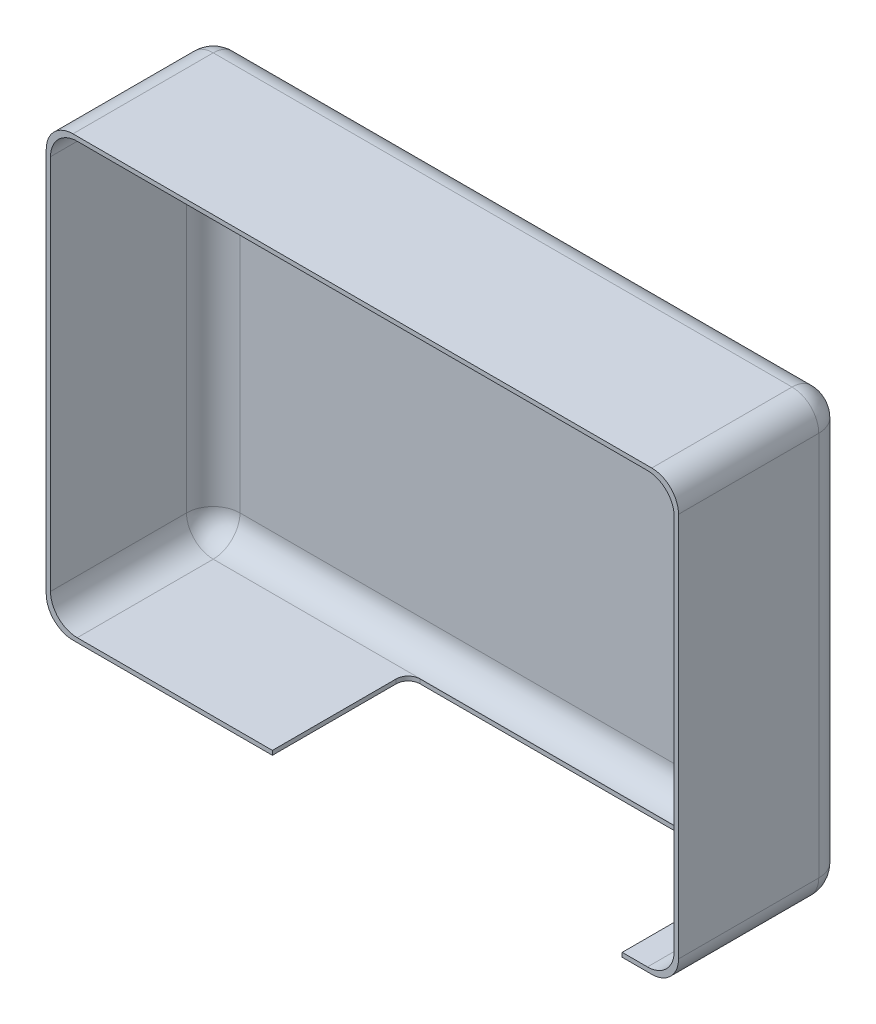
ISO-10303-21;
HEADER;
FILE_DESCRIPTION(('STEP AP214'),'2;1');
FILE_NAME('part.step','',(''),(''),'','','');
FILE_SCHEMA(('AUTOMOTIVE_DESIGN { 1 0 10303 214 1 1 1 1 }'));
ENDSEC;
DATA;
#1=APPLICATION_CONTEXT('core data for automotive mechanical design processes');
#2=APPLICATION_PROTOCOL_DEFINITION('international standard','automotive_design',2000,#1);
#3=PRODUCT_CONTEXT('',#1,'mechanical');
#4=PRODUCT('Part','Part','',(#3));
#5=PRODUCT_RELATED_PRODUCT_CATEGORY('part','',(#4));
#6=PRODUCT_DEFINITION_FORMATION('','',#4);
#7=PRODUCT_DEFINITION_CONTEXT('part definition',#1,'design');
#8=PRODUCT_DEFINITION('design','',#6,#7);
#9=PRODUCT_DEFINITION_SHAPE('','',#8);
#10=(LENGTH_UNIT() NAMED_UNIT(*) SI_UNIT(.MILLI.,.METRE.));
#11=(NAMED_UNIT(*) PLANE_ANGLE_UNIT() SI_UNIT($,.RADIAN.));
#12=(NAMED_UNIT(*) SI_UNIT($,.STERADIAN.) SOLID_ANGLE_UNIT());
#13=UNCERTAINTY_MEASURE_WITH_UNIT(LENGTH_MEASURE(1.E-05),#10,'distance_accuracy_value','');
#14=(GEOMETRIC_REPRESENTATION_CONTEXT(3) GLOBAL_UNCERTAINTY_ASSIGNED_CONTEXT((#13)) GLOBAL_UNIT_ASSIGNED_CONTEXT((#10,
#11,#12)) REPRESENTATION_CONTEXT('',''));
#15=CARTESIAN_POINT('',(0.,0.,0.));
#16=DIRECTION('',(0.,0.,1.));
#17=DIRECTION('',(1.,0.,0.));
#18=AXIS2_PLACEMENT_3D('',#15,#16,#17);
#19=CARTESIAN_POINT('',(-41.4059441680608,-197.145783761646,14.224));
#20=DIRECTION('',(-1.,0.,0.));
#21=DIRECTION('',(0.,0.,1.));
#22=AXIS2_PLACEMENT_3D('',#19,#20,#21);
#23=CYLINDRICAL_SURFACE('',#22,14.224);
#24=CARTESIAN_POINT('',(-41.4059441680606,-197.145783761646,14.224));
#25=DIRECTION('',(-1.,0.,0.));
#26=DIRECTION('',(0.,0.,1.));
#27=AXIS2_PLACEMENT_3D('',#24,#25,#26);
#28=CIRCLE('',#27,14.224);
#29=CARTESIAN_POINT('',(-41.4059441680606,-197.145783761646,0.));
#30=VERTEX_POINT('',#29);
#31=CARTESIAN_POINT('',(-41.4059441680606,-211.369783761646,14.224));
#32=VERTEX_POINT('',#31);
#33=EDGE_CURVE('E11',#30,#32,#28,.T.);
#34=ORIENTED_EDGE('',*,*,#33,.F.);
#35=DIRECTION('',(-1.,0.,0.));
#36=VECTOR('',#35,1.);
#37=CARTESIAN_POINT('',(-41.4059441680608,-197.145783761646,0.));
#38=LINE('',#37,#36);
#39=CARTESIAN_POINT('',(266.696055831939,-197.145783761646,0.));
#40=VERTEX_POINT('',#39);
#41=EDGE_CURVE('E392',#40,#30,#38,.T.);
#42=ORIENTED_EDGE('',*,*,#41,.F.);
#43=CARTESIAN_POINT('',(266.696055831939,-197.145783761646,14.224));
#44=DIRECTION('',(-1.,0.,0.));
#45=DIRECTION('',(0.,-1.,0.));
#46=AXIS2_PLACEMENT_3D('',#43,#44,#45);
#47=CIRCLE('',#46,14.224);
#48=CARTESIAN_POINT('',(266.696055831939,-211.369783761646,14.224));
#49=VERTEX_POINT('',#48);
#50=EDGE_CURVE('E40',#40,#49,#47,.T.);
#51=ORIENTED_EDGE('',*,*,#50,.T.);
#52=DIRECTION('',(-1.,0.,0.));
#53=VECTOR('',#52,1.);
#54=CARTESIAN_POINT('',(-41.4059441680606,-211.369783761646,14.224));
#55=LINE('',#54,#53);
#56=EDGE_CURVE('E422',#32,#49,#55,.F.);
#57=ORIENTED_EDGE('',*,*,#56,.F.);
#58=EDGE_LOOP('',(#34,#42,#51,#57));
#59=FACE_BOUND('',#58,.T.);
#60=ADVANCED_FACE('F33',(#59),#23,.T.);
#61=CARTESIAN_POINT('',(266.696055831939,-197.145783761646,14.224));
#62=DIRECTION('',(0.,0.,1.));
#63=DIRECTION('',(1.,0.,0.));
#64=AXIS2_PLACEMENT_3D('',#61,#62,#63);
#65=SPHERICAL_SURFACE('',#64,14.224);
#66=ORIENTED_EDGE('',*,*,#50,.F.);
#67=CARTESIAN_POINT('',(266.696055831939,-197.145783761645,14.224));
#68=DIRECTION('',(0.,-1.,0.));
#69=DIRECTION('',(0.,0.,-1.));
#70=AXIS2_PLACEMENT_3D('',#67,#68,#69);
#71=CIRCLE('',#70,14.224);
#72=CARTESIAN_POINT('',(280.920055831939,-197.145783761645,14.224));
#73=VERTEX_POINT('',#72);
#74=EDGE_CURVE('E434',#40,#73,#71,.T.);
#75=ORIENTED_EDGE('',*,*,#74,.T.);
#76=CARTESIAN_POINT('',(266.696055831939,-197.145783761646,14.224));
#77=DIRECTION('',(0.,0.,-1.));
#78=DIRECTION('',(-1.,0.,0.));
#79=AXIS2_PLACEMENT_3D('',#76,#77,#78);
#80=CIRCLE('',#79,14.224);
#81=EDGE_CURVE('E419',#49,#73,#80,.F.);
#82=ORIENTED_EDGE('',*,*,#81,.F.);
#83=EDGE_LOOP('',(#66,#75,#82));
#84=FACE_BOUND('',#83,.T.);
#85=ADVANCED_FACE('F438',(#84),#65,.T.);
#86=CARTESIAN_POINT('',(266.696055831939,7.83221623835449,14.224));
#87=DIRECTION('',(0.,-1.,0.));
#88=DIRECTION('',(1.,0.,0.));
#89=AXIS2_PLACEMENT_3D('',#86,#87,#88);
#90=CYLINDRICAL_SURFACE('',#89,14.224);
#91=ORIENTED_EDGE('',*,*,#74,.F.);
#92=DIRECTION('',(0.,-1.,0.));
#93=VECTOR('',#92,1.);
#94=CARTESIAN_POINT('',(266.696055831939,7.83221623835449,0.));
#95=LINE('',#94,#93);
#96=CARTESIAN_POINT('',(266.696055831939,7.83221623835431,0.));
#97=VERTEX_POINT('',#96);
#98=EDGE_CURVE('E395',#97,#40,#95,.T.);
#99=ORIENTED_EDGE('',*,*,#98,.F.);
#100=CARTESIAN_POINT('',(266.696055831939,7.83221623835441,14.224));
#101=DIRECTION('',(0.,-1.,0.));
#102=DIRECTION('',(1.,0.,0.));
#103=AXIS2_PLACEMENT_3D('',#100,#101,#102);
#104=CIRCLE('',#103,14.224);
#105=CARTESIAN_POINT('',(280.920055831939,7.83221623835431,14.224));
#106=VERTEX_POINT('',#105);
#107=EDGE_CURVE('E432',#97,#106,#104,.T.);
#108=ORIENTED_EDGE('',*,*,#107,.T.);
#109=DIRECTION('',(0.,-1.,0.));
#110=VECTOR('',#109,1.);
#111=CARTESIAN_POINT('',(280.920055831939,7.83221623835431,14.224));
#112=LINE('',#111,#110);
#113=EDGE_CURVE('E416',#73,#106,#112,.F.);
#114=ORIENTED_EDGE('',*,*,#113,.F.);
#115=EDGE_LOOP('',(#91,#99,#108,#114));
#116=FACE_BOUND('',#115,.T.);
#117=ADVANCED_FACE('F448',(#116),#90,.T.);
#118=CARTESIAN_POINT('',(266.696055831939,7.83221623835441,14.224));
#119=DIRECTION('',(0.,0.,1.));
#120=DIRECTION('',(1.,0.,0.));
#121=AXIS2_PLACEMENT_3D('',#118,#119,#120);
#122=SPHERICAL_SURFACE('',#121,14.224);
#123=ORIENTED_EDGE('',*,*,#107,.F.);
#124=CARTESIAN_POINT('',(266.696055831939,7.83221623835441,14.224));
#125=DIRECTION('',(1.,0.,0.));
#126=DIRECTION('',(0.,0.,-1.));
#127=AXIS2_PLACEMENT_3D('',#124,#125,#126);
#128=CIRCLE('',#127,14.224);
#129=CARTESIAN_POINT('',(266.696055831939,22.0562162383544,14.224));
#130=VERTEX_POINT('',#129);
#131=EDGE_CURVE('E430',#97,#130,#128,.T.);
#132=ORIENTED_EDGE('',*,*,#131,.T.);
#133=CARTESIAN_POINT('',(266.696055831939,7.83221623835441,14.224));
#134=DIRECTION('',(0.,0.,-1.));
#135=DIRECTION('',(-1.,0.,0.));
#136=AXIS2_PLACEMENT_3D('',#133,#134,#135);
#137=CIRCLE('',#136,14.224);
#138=EDGE_CURVE('E413',#106,#130,#137,.F.);
#139=ORIENTED_EDGE('',*,*,#138,.F.);
#140=EDGE_LOOP('',(#123,#132,#139));
#141=FACE_BOUND('',#140,.T.);
#142=ADVANCED_FACE('F485',(#141),#122,.T.);
#143=CARTESIAN_POINT('',(-41.4059441680608,7.83221623835441,14.224));
#144=DIRECTION('',(1.,0.,0.));
#145=DIRECTION('',(0.,0.,-1.));
#146=AXIS2_PLACEMENT_3D('',#143,#144,#145);
#147=CYLINDRICAL_SURFACE('',#146,14.224);
#148=ORIENTED_EDGE('',*,*,#131,.F.);
#149=DIRECTION('',(1.,0.,0.));
#150=VECTOR('',#149,1.);
#151=CARTESIAN_POINT('',(-41.4059441680608,7.83221623835441,0.));
#152=LINE('',#151,#150);
#153=CARTESIAN_POINT('',(-41.4059441680607,7.83221623835441,0.));
#154=VERTEX_POINT('',#153);
#155=EDGE_CURVE('E398',#154,#97,#152,.T.);
#156=ORIENTED_EDGE('',*,*,#155,.F.);
#157=CARTESIAN_POINT('',(-41.4059441680608,7.83221623835441,14.224));
#158=DIRECTION('',(1.,0.,0.));
#159=DIRECTION('',(0.,1.,0.));
#160=AXIS2_PLACEMENT_3D('',#157,#158,#159);
#161=CIRCLE('',#160,14.224);
#162=CARTESIAN_POINT('',(-41.4059441680607,22.0562162383544,14.224));
#163=VERTEX_POINT('',#162);
#164=EDGE_CURVE('E428',#154,#163,#161,.T.);
#165=ORIENTED_EDGE('',*,*,#164,.T.);
#166=DIRECTION('',(1.,0.,0.));
#167=VECTOR('',#166,1.);
#168=CARTESIAN_POINT('',(-41.4059441680607,22.0562162383544,14.224));
#169=LINE('',#168,#167);
#170=EDGE_CURVE('E410',#130,#163,#169,.F.);
#171=ORIENTED_EDGE('',*,*,#170,.F.);
#172=EDGE_LOOP('',(#148,#156,#165,#171));
#173=FACE_BOUND('',#172,.T.);
#174=ADVANCED_FACE('F482',(#173),#147,.T.);
#175=CARTESIAN_POINT('',(-41.4059441680608,7.83221623835441,14.224));
#176=DIRECTION('',(0.,0.,1.));
#177=DIRECTION('',(1.,0.,0.));
#178=AXIS2_PLACEMENT_3D('',#175,#176,#177);
#179=SPHERICAL_SURFACE('',#178,14.224);
#180=ORIENTED_EDGE('',*,*,#164,.F.);
#181=CARTESIAN_POINT('',(-41.4059441680608,7.83221623835431,14.224));
#182=DIRECTION('',(0.,1.,0.));
#183=DIRECTION('',(-1.,0.,0.));
#184=AXIS2_PLACEMENT_3D('',#181,#182,#183);
#185=CIRCLE('',#184,14.224);
#186=CARTESIAN_POINT('',(-55.6299441680608,7.83221623835431,14.224));
#187=VERTEX_POINT('',#186);
#188=EDGE_CURVE('E426',#154,#187,#185,.T.);
#189=ORIENTED_EDGE('',*,*,#188,.T.);
#190=CARTESIAN_POINT('',(-41.4059441680608,7.83221623835441,14.224));
#191=DIRECTION('',(0.,0.,-1.));
#192=DIRECTION('',(-1.,0.,0.));
#193=AXIS2_PLACEMENT_3D('',#190,#191,#192);
#194=CIRCLE('',#193,14.224);
#195=EDGE_CURVE('E407',#163,#187,#194,.F.);
#196=ORIENTED_EDGE('',*,*,#195,.F.);
#197=EDGE_LOOP('',(#180,#189,#196));
#198=FACE_BOUND('',#197,.T.);
#199=ADVANCED_FACE('F587',(#198),#179,.T.);
#200=CARTESIAN_POINT('',(-41.4059441680608,7.83221623835441,14.224));
#201=DIRECTION('',(0.,1.,0.));
#202=DIRECTION('',(-1.,0.,0.));
#203=AXIS2_PLACEMENT_3D('',#200,#201,#202);
#204=CYLINDRICAL_SURFACE('',#203,14.224);
#205=ORIENTED_EDGE('',*,*,#188,.F.);
#206=DIRECTION('',(0.,1.,0.));
#207=VECTOR('',#206,1.);
#208=CARTESIAN_POINT('',(-41.4059441680608,7.83221623835441,0.));
#209=LINE('',#208,#207);
#210=EDGE_CURVE('E401',#30,#154,#209,.T.);
#211=ORIENTED_EDGE('',*,*,#210,.F.);
#212=CARTESIAN_POINT('',(-41.4059441680607,-197.145783761646,14.224));
#213=DIRECTION('',(0.,1.,0.));
#214=DIRECTION('',(-1.,0.,0.));
#215=AXIS2_PLACEMENT_3D('',#212,#213,#214);
#216=CIRCLE('',#215,14.224);
#217=CARTESIAN_POINT('',(-55.6299441680607,-197.145783761645,14.224));
#218=VERTEX_POINT('',#217);
#219=EDGE_CURVE('E424',#30,#218,#216,.T.);
#220=ORIENTED_EDGE('',*,*,#219,.T.);
#221=DIRECTION('',(0.,1.,0.));
#222=VECTOR('',#221,1.);
#223=CARTESIAN_POINT('',(-55.6299441680608,7.83221623835431,14.224));
#224=LINE('',#223,#222);
#225=EDGE_CURVE('E404',#187,#218,#224,.F.);
#226=ORIENTED_EDGE('',*,*,#225,.F.);
#227=EDGE_LOOP('',(#205,#211,#220,#226));
#228=FACE_BOUND('',#227,.T.);
#229=ADVANCED_FACE('F476',(#228),#204,.T.);
#230=CARTESIAN_POINT('',(-41.4059441680607,-197.145783761646,14.224));
#231=DIRECTION('',(0.,0.,1.));
#232=DIRECTION('',(1.,0.,0.));
#233=AXIS2_PLACEMENT_3D('',#230,#231,#232);
#234=SPHERICAL_SURFACE('',#233,14.224);
#235=ORIENTED_EDGE('',*,*,#219,.F.);
#236=ORIENTED_EDGE('',*,*,#33,.T.);
#237=CARTESIAN_POINT('',(-41.4059441680607,-197.145783761646,14.224));
#238=DIRECTION('',(0.,0.,-1.));
#239=DIRECTION('',(-1.,0.,0.));
#240=AXIS2_PLACEMENT_3D('',#237,#238,#239);
#241=CIRCLE('',#240,14.224);
#242=EDGE_CURVE('E389',#218,#32,#241,.F.);
#243=ORIENTED_EDGE('',*,*,#242,.F.);
#244=EDGE_LOOP('',(#235,#236,#243));
#245=FACE_BOUND('',#244,.T.);
#246=ADVANCED_FACE('F471',(#245),#234,.T.);
#247=CARTESIAN_POINT('',(-39.1199441680606,-194.859783761646,16.51));
#248=DIRECTION('',(0.,-1.,0.));
#249=DIRECTION('',(1.,0.,0.));
#250=AXIS2_PLACEMENT_3D('',#247,#248,#249);
#251=CYLINDRICAL_SURFACE('',#250,14.224);
#252=CARTESIAN_POINT('',(-39.1199441680606,-194.859783761646,16.51));
#253=DIRECTION('',(0.,1.,0.));
#254=DIRECTION('',(0.,0.,1.));
#255=AXIS2_PLACEMENT_3D('',#252,#253,#254);
#256=CIRCLE('',#255,14.224);
#257=CARTESIAN_POINT('',(-39.1199441680606,-194.859783761646,2.286));
#258=VERTEX_POINT('',#257);
#259=CARTESIAN_POINT('',(-53.3439441680606,-194.859783761646,16.51));
#260=VERTEX_POINT('',#259);
#261=EDGE_CURVE('E387',#258,#260,#256,.T.);
#262=ORIENTED_EDGE('',*,*,#261,.F.);
#263=DIRECTION('',(0.,-1.,0.));
#264=VECTOR('',#263,1.);
#265=CARTESIAN_POINT('',(-39.1199441680606,-194.859783761646,2.286));
#266=LINE('',#265,#264);
#267=CARTESIAN_POINT('',(-39.1199441680608,5.54621623835437,2.286));
#268=VERTEX_POINT('',#267);
#269=EDGE_CURVE('E340',#268,#258,#266,.T.);
#270=ORIENTED_EDGE('',*,*,#269,.F.);
#271=CARTESIAN_POINT('',(-39.1199441680608,5.5462162383544,16.51));
#272=DIRECTION('',(0.,1.,0.));
#273=DIRECTION('',(-1.,0.,0.));
#274=AXIS2_PLACEMENT_3D('',#271,#272,#273);
#275=CIRCLE('',#274,14.224);
#276=CARTESIAN_POINT('',(-53.3439441680608,5.54621623835436,16.51));
#277=VERTEX_POINT('',#276);
#278=EDGE_CURVE('E385',#268,#277,#275,.T.);
#279=ORIENTED_EDGE('',*,*,#278,.T.);
#280=DIRECTION('',(0.,-1.,0.));
#281=VECTOR('',#280,1.);
#282=CARTESIAN_POINT('',(-53.3439441680606,-194.859783761646,16.51));
#283=LINE('',#282,#281);
#284=EDGE_CURVE('E370',#260,#277,#283,.F.);
#285=ORIENTED_EDGE('',*,*,#284,.F.);
#286=EDGE_LOOP('',(#262,#270,#279,#285));
#287=FACE_BOUND('',#286,.T.);
#288=ADVANCED_FACE('F550',(#287),#251,.F.);
#289=CARTESIAN_POINT('',(-39.1199441680607,5.5462162383544,16.51));
#290=DIRECTION('',(0.,0.,1.));
#291=DIRECTION('',(1.,0.,0.));
#292=AXIS2_PLACEMENT_3D('',#289,#290,#291);
#293=SPHERICAL_SURFACE('',#292,14.224);
#294=ORIENTED_EDGE('',*,*,#278,.F.);
#295=CARTESIAN_POINT('',(-39.1199441680608,5.54621623835442,16.51));
#296=DIRECTION('',(1.,0.,0.));
#297=DIRECTION('',(0.,0.,-1.));
#298=AXIS2_PLACEMENT_3D('',#295,#296,#297);
#299=CIRCLE('',#298,14.224);
#300=CARTESIAN_POINT('',(-39.1199441680608,19.7702162383544,16.51));
#301=VERTEX_POINT('',#300);
#302=EDGE_CURVE('E383',#268,#301,#299,.T.);
#303=ORIENTED_EDGE('',*,*,#302,.T.);
#304=CARTESIAN_POINT('',(-39.1199441680607,5.5462162383544,16.51));
#305=DIRECTION('',(0.,0.,1.));
#306=DIRECTION('',(1.,0.,0.));
#307=AXIS2_PLACEMENT_3D('',#304,#305,#306);
#308=CIRCLE('',#307,14.224);
#309=EDGE_CURVE('E367',#277,#301,#308,.F.);
#310=ORIENTED_EDGE('',*,*,#309,.F.);
#311=EDGE_LOOP('',(#294,#303,#310));
#312=FACE_BOUND('',#311,.T.);
#313=ADVANCED_FACE('F553',(#312),#293,.F.);
#314=CARTESIAN_POINT('',(-39.1199441680606,5.54621623835441,16.51));
#315=DIRECTION('',(-1.,0.,0.));
#316=DIRECTION('',(0.,0.,1.));
#317=AXIS2_PLACEMENT_3D('',#314,#315,#316);
#318=CYLINDRICAL_SURFACE('',#317,14.224);
#319=ORIENTED_EDGE('',*,*,#302,.F.);
#320=DIRECTION('',(-1.,0.,0.));
#321=VECTOR('',#320,1.);
#322=CARTESIAN_POINT('',(-39.1199441680606,5.54621623835441,2.286));
#323=LINE('',#322,#321);
#324=CARTESIAN_POINT('',(264.410055831939,5.5462162383544,2.286));
#325=VERTEX_POINT('',#324);
#326=EDGE_CURVE('E343',#325,#268,#323,.T.);
#327=ORIENTED_EDGE('',*,*,#326,.F.);
#328=CARTESIAN_POINT('',(264.410055831939,5.5462162383544,16.51));
#329=DIRECTION('',(1.,0.,0.));
#330=DIRECTION('',(0.,0.,-1.));
#331=AXIS2_PLACEMENT_3D('',#328,#329,#330);
#332=CIRCLE('',#331,14.224);
#333=CARTESIAN_POINT('',(264.410055831939,19.7702162383544,16.51));
#334=VERTEX_POINT('',#333);
#335=EDGE_CURVE('E381',#325,#334,#332,.T.);
#336=ORIENTED_EDGE('',*,*,#335,.T.);
#337=DIRECTION('',(-1.,0.,0.));
#338=VECTOR('',#337,1.);
#339=CARTESIAN_POINT('',(-39.1199441680608,19.7702162383544,16.51));
#340=LINE('',#339,#338);
#341=EDGE_CURVE('E364',#301,#334,#340,.F.);
#342=ORIENTED_EDGE('',*,*,#341,.F.);
#343=EDGE_LOOP('',(#319,#327,#336,#342));
#344=FACE_BOUND('',#343,.T.);
#345=ADVANCED_FACE('F556',(#344),#318,.F.);
#346=CARTESIAN_POINT('',(264.410055831939,5.5462162383544,16.51));
#347=DIRECTION('',(0.,0.,1.));
#348=DIRECTION('',(1.,0.,0.));
#349=AXIS2_PLACEMENT_3D('',#346,#347,#348);
#350=SPHERICAL_SURFACE('',#349,14.224);
#351=ORIENTED_EDGE('',*,*,#335,.F.);
#352=CARTESIAN_POINT('',(264.410055831939,5.5462162383544,16.51));
#353=DIRECTION('',(0.,-1.,0.));
#354=DIRECTION('',(0.,0.,-1.));
#355=AXIS2_PLACEMENT_3D('',#352,#353,#354);
#356=CIRCLE('',#355,14.224);
#357=CARTESIAN_POINT('',(278.634055831939,5.5462162383544,16.51));
#358=VERTEX_POINT('',#357);
#359=EDGE_CURVE('E379',#325,#358,#356,.T.);
#360=ORIENTED_EDGE('',*,*,#359,.T.);
#361=CARTESIAN_POINT('',(264.410055831939,5.5462162383544,16.51));
#362=DIRECTION('',(0.,0.,1.));
#363=DIRECTION('',(1.,0.,0.));
#364=AXIS2_PLACEMENT_3D('',#361,#362,#363);
#365=CIRCLE('',#364,14.224);
#366=EDGE_CURVE('E361',#334,#358,#365,.F.);
#367=ORIENTED_EDGE('',*,*,#366,.F.);
#368=EDGE_LOOP('',(#351,#360,#367));
#369=FACE_BOUND('',#368,.T.);
#370=ADVANCED_FACE('F564',(#369),#350,.F.);
#371=CARTESIAN_POINT('',(264.410055831939,-194.859783761646,16.51));
#372=DIRECTION('',(0.,1.,0.));
#373=DIRECTION('',(0.,0.,1.));
#374=AXIS2_PLACEMENT_3D('',#371,#372,#373);
#375=CYLINDRICAL_SURFACE('',#374,14.224);
#376=ORIENTED_EDGE('',*,*,#359,.F.);
#377=DIRECTION('',(0.,1.,0.));
#378=VECTOR('',#377,1.);
#379=CARTESIAN_POINT('',(264.410055831939,-194.859783761646,2.286));
#380=LINE('',#379,#378);
#381=CARTESIAN_POINT('',(264.410055831939,-194.859783761646,2.286));
#382=VERTEX_POINT('',#381);
#383=EDGE_CURVE('E346',#382,#325,#380,.T.);
#384=ORIENTED_EDGE('',*,*,#383,.F.);
#385=CARTESIAN_POINT('',(264.410055831939,-194.859783761646,16.51));
#386=DIRECTION('',(0.,-1.,0.));
#387=DIRECTION('',(0.,0.,-1.));
#388=AXIS2_PLACEMENT_3D('',#385,#386,#387);
#389=CIRCLE('',#388,14.224);
#390=CARTESIAN_POINT('',(278.634055831939,-194.859783761646,16.51));
#391=VERTEX_POINT('',#390);
#392=EDGE_CURVE('E377',#382,#391,#389,.T.);
#393=ORIENTED_EDGE('',*,*,#392,.T.);
#394=DIRECTION('',(0.,1.,0.));
#395=VECTOR('',#394,1.);
#396=CARTESIAN_POINT('',(278.634055831939,-194.859783761646,16.51));
#397=LINE('',#396,#395);
#398=EDGE_CURVE('E358',#358,#391,#397,.F.);
#399=ORIENTED_EDGE('',*,*,#398,.F.);
#400=EDGE_LOOP('',(#376,#384,#393,#399));
#401=FACE_BOUND('',#400,.T.);
#402=ADVANCED_FACE('F562',(#401),#375,.F.);
#403=CARTESIAN_POINT('',(264.410055831939,-194.859783761646,16.51));
#404=DIRECTION('',(0.,0.,1.));
#405=DIRECTION('',(1.,0.,0.));
#406=AXIS2_PLACEMENT_3D('',#403,#404,#405);
#407=SPHERICAL_SURFACE('',#406,14.224);
#408=ORIENTED_EDGE('',*,*,#392,.F.);
#409=CARTESIAN_POINT('',(264.410055831939,-194.859783761646,16.51));
#410=DIRECTION('',(-1.,0.,0.));
#411=DIRECTION('',(0.,0.,1.));
#412=AXIS2_PLACEMENT_3D('',#409,#410,#411);
#413=CIRCLE('',#412,14.224);
#414=CARTESIAN_POINT('',(264.410055831939,-209.083783761646,16.51));
#415=VERTEX_POINT('',#414);
#416=EDGE_CURVE('E375',#382,#415,#413,.T.);
#417=ORIENTED_EDGE('',*,*,#416,.T.);
#418=CARTESIAN_POINT('',(264.410055831939,-194.859783761646,16.51));
#419=DIRECTION('',(0.,0.,1.));
#420=DIRECTION('',(1.,0.,0.));
#421=AXIS2_PLACEMENT_3D('',#418,#419,#420);
#422=CIRCLE('',#421,14.224);
#423=EDGE_CURVE('E355',#391,#415,#422,.F.);
#424=ORIENTED_EDGE('',*,*,#423,.F.);
#425=EDGE_LOOP('',(#408,#417,#424));
#426=FACE_BOUND('',#425,.T.);
#427=ADVANCED_FACE('F571',(#426),#407,.F.);
#428=CARTESIAN_POINT('',(-39.1199441680606,-194.859783761646,16.51));
#429=DIRECTION('',(1.,0.,0.));
#430=DIRECTION('',(0.,0.,-1.));
#431=AXIS2_PLACEMENT_3D('',#428,#429,#430);
#432=CYLINDRICAL_SURFACE('',#431,14.224);
#433=ORIENTED_EDGE('',*,*,#416,.F.);
#434=DIRECTION('',(1.,0.,0.));
#435=VECTOR('',#434,1.);
#436=CARTESIAN_POINT('',(-39.1199441680606,-194.859783761646,2.286));
#437=LINE('',#436,#435);
#438=EDGE_CURVE('E349',#258,#382,#437,.T.);
#439=ORIENTED_EDGE('',*,*,#438,.F.);
#440=CARTESIAN_POINT('',(-39.1199441680606,-194.859783761646,16.51));
#441=DIRECTION('',(-1.,0.,0.));
#442=DIRECTION('',(0.,0.,1.));
#443=AXIS2_PLACEMENT_3D('',#440,#441,#442);
#444=CIRCLE('',#443,14.224);
#445=CARTESIAN_POINT('',(-39.1199441680606,-209.083783761646,16.51));
#446=VERTEX_POINT('',#445);
#447=EDGE_CURVE('E373',#258,#446,#444,.T.);
#448=ORIENTED_EDGE('',*,*,#447,.T.);
#449=DIRECTION('',(1.,0.,0.));
#450=VECTOR('',#449,1.);
#451=CARTESIAN_POINT('',(-39.1199441680606,-209.083783761646,16.51));
#452=LINE('',#451,#450);
#453=EDGE_CURVE('E352',#415,#446,#452,.F.);
#454=ORIENTED_EDGE('',*,*,#453,.F.);
#455=EDGE_LOOP('',(#433,#439,#448,#454));
#456=FACE_BOUND('',#455,.T.);
#457=ADVANCED_FACE('F625',(#456),#432,.F.);
#458=CARTESIAN_POINT('',(-39.1199441680606,-194.859783761646,16.51));
#459=DIRECTION('',(0.,0.,1.));
#460=DIRECTION('',(1.,0.,0.));
#461=AXIS2_PLACEMENT_3D('',#458,#459,#460);
#462=SPHERICAL_SURFACE('',#461,14.224);
#463=ORIENTED_EDGE('',*,*,#447,.F.);
#464=ORIENTED_EDGE('',*,*,#261,.T.);
#465=CARTESIAN_POINT('',(-39.1199441680606,-194.859783761646,16.51));
#466=DIRECTION('',(0.,0.,1.));
#467=DIRECTION('',(1.,0.,0.));
#468=AXIS2_PLACEMENT_3D('',#465,#466,#467);
#469=CIRCLE('',#468,14.224);
#470=EDGE_CURVE('E337',#446,#260,#469,.F.);
#471=ORIENTED_EDGE('',*,*,#470,.F.);
#472=EDGE_LOOP('',(#463,#464,#471));
#473=FACE_BOUND('',#472,.T.);
#474=ADVANCED_FACE('F546',(#473),#462,.F.);
#475=CARTESIAN_POINT('',(-41.4059441680608,7.83221623835441,88.9));
#476=DIRECTION('',(0.,0.,-1.));
#477=DIRECTION('',(-1.,0.,0.));
#478=AXIS2_PLACEMENT_3D('',#475,#476,#477);
#479=CYLINDRICAL_SURFACE('',#478,14.224);
#480=DIRECTION('',(0.,0.,-1.));
#481=VECTOR('',#480,1.);
#482=CARTESIAN_POINT('',(-41.4059441680607,22.0562162383544,88.9));
#483=LINE('',#482,#481);
#484=CARTESIAN_POINT('',(-41.4059441680607,22.0562162383544,88.9));
#485=VERTEX_POINT('',#484);
#486=EDGE_CURVE('E313',#485,#163,#483,.T.);
#487=ORIENTED_EDGE('',*,*,#486,.T.);
#488=ORIENTED_EDGE('',*,*,#195,.T.);
#489=DIRECTION('',(0.,0.,-1.));
#490=VECTOR('',#489,1.);
#491=CARTESIAN_POINT('',(-55.6299441680608,7.83221623835431,88.9));
#492=LINE('',#491,#490);
#493=CARTESIAN_POINT('',(-55.6299441680608,7.83221623835431,88.9));
#494=VERTEX_POINT('',#493);
#495=EDGE_CURVE('E334',#494,#187,#492,.T.);
#496=ORIENTED_EDGE('',*,*,#495,.F.);
#497=CARTESIAN_POINT('',(-41.4059441680608,7.83221623835441,88.9));
#498=DIRECTION('',(0.,0.,1.));
#499=DIRECTION('',(1.,0.,0.));
#500=AXIS2_PLACEMENT_3D('',#497,#498,#499);
#501=CIRCLE('',#500,14.224);
#502=EDGE_CURVE('E280',#485,#494,#501,.T.);
#503=ORIENTED_EDGE('',*,*,#502,.F.);
#504=EDGE_LOOP('',(#487,#488,#496,#503));
#505=FACE_BOUND('',#504,.T.);
#506=ADVANCED_FACE('F495',(#505),#479,.T.);
#507=CARTESIAN_POINT('',(-55.6299441680608,7.83221623835431,88.9));
#508=DIRECTION('',(1.,0.,0.));
#509=DIRECTION('',(0.,1.,0.));
#510=AXIS2_PLACEMENT_3D('',#507,#508,#509);
#511=PLANE('',#510);
#512=ORIENTED_EDGE('',*,*,#495,.T.);
#513=ORIENTED_EDGE('',*,*,#225,.T.);
#514=DIRECTION('',(0.,0.,-1.));
#515=VECTOR('',#514,1.);
#516=CARTESIAN_POINT('',(-55.6299441680607,-197.145783761645,88.9));
#517=LINE('',#516,#515);
#518=CARTESIAN_POINT('',(-55.6299441680607,-197.145783761645,88.9));
#519=VERTEX_POINT('',#518);
#520=EDGE_CURVE('E331',#519,#218,#517,.T.);
#521=ORIENTED_EDGE('',*,*,#520,.F.);
#522=DIRECTION('',(0.,-1.,0.));
#523=VECTOR('',#522,1.);
#524=CARTESIAN_POINT('',(-55.6299441680608,7.83221623835431,88.9));
#525=LINE('',#524,#523);
#526=EDGE_CURVE('E297',#494,#519,#525,.T.);
#527=ORIENTED_EDGE('',*,*,#526,.F.);
#528=EDGE_LOOP('',(#512,#513,#521,#527));
#529=FACE_BOUND('',#528,.T.);
#530=ADVANCED_FACE('F498',(#529),#511,.F.);
#531=CARTESIAN_POINT('',(-41.4059441680607,-197.145783761646,88.9));
#532=DIRECTION('',(0.,0.,-1.));
#533=DIRECTION('',(-1.,0.,0.));
#534=AXIS2_PLACEMENT_3D('',#531,#532,#533);
#535=CYLINDRICAL_SURFACE('',#534,14.224);
#536=ORIENTED_EDGE('',*,*,#520,.T.);
#537=ORIENTED_EDGE('',*,*,#242,.T.);
#538=DIRECTION('',(0.,0.,-1.));
#539=VECTOR('',#538,1.);
#540=CARTESIAN_POINT('',(-41.4059441680606,-211.369783761646,88.9));
#541=LINE('',#540,#539);
#542=CARTESIAN_POINT('',(-41.4059441680606,-211.369783761646,88.9));
#543=VERTEX_POINT('',#542);
#544=EDGE_CURVE('E328',#543,#32,#541,.T.);
#545=ORIENTED_EDGE('',*,*,#544,.F.);
#546=CARTESIAN_POINT('',(-41.4059441680607,-197.145783761646,88.9));
#547=DIRECTION('',(0.,0.,1.));
#548=DIRECTION('',(1.,0.,0.));
#549=AXIS2_PLACEMENT_3D('',#546,#547,#548);
#550=CIRCLE('',#549,14.224);
#551=EDGE_CURVE('E299',#519,#543,#550,.T.);
#552=ORIENTED_EDGE('',*,*,#551,.F.);
#553=EDGE_LOOP('',(#536,#537,#545,#552));
#554=FACE_BOUND('',#553,.T.);
#555=ADVANCED_FACE('F467',(#554),#535,.T.);
#556=CARTESIAN_POINT('',(-41.4059441680606,-211.369783761646,88.9));
#557=DIRECTION('',(0.,1.,0.));
#558=DIRECTION('',(0.,0.,1.));
#559=AXIS2_PLACEMENT_3D('',#556,#557,#558);
#560=PLANE('',#559);
#561=CARTESIAN_POINT('',(71.1081514905819,-211.369783761646,22.9944197792705));
#562=DIRECTION('',(0.,-1.,0.));
#563=DIRECTION('',(0.,0.,1.));
#564=AXIS2_PLACEMENT_3D('',#561,#562,#563);
#565=CIRCLE('',#564,6.35);
#566=CARTESIAN_POINT('',(64.7581514905819,-211.369783761646,22.9944197792706));
#567=VERTEX_POINT('',#566);
#568=CARTESIAN_POINT('',(71.108151490582,-211.369783761646,16.6444197792706));
#569=VERTEX_POINT('',#568);
#570=EDGE_CURVE('E228',#567,#569,#565,.T.);
#571=ORIENTED_EDGE('',*,*,#570,.F.);
#572=DIRECTION('',(0.,0.,-1.));
#573=VECTOR('',#572,1.);
#574=CARTESIAN_POINT('',(64.7581514905819,-211.369783761646,88.9));
#575=LINE('',#574,#573);
#576=CARTESIAN_POINT('',(64.7581514905819,-211.369783761646,88.9));
#577=VERTEX_POINT('',#576);
#578=EDGE_CURVE('E239',#577,#567,#575,.T.);
#579=ORIENTED_EDGE('',*,*,#578,.F.);
#580=DIRECTION('',(1.,0.,0.));
#581=VECTOR('',#580,1.);
#582=CARTESIAN_POINT('',(-41.4059441680606,-211.369783761646,88.9));
#583=LINE('',#582,#581);
#584=EDGE_CURVE('E302',#543,#577,#583,.T.);
#585=ORIENTED_EDGE('',*,*,#584,.F.);
#586=ORIENTED_EDGE('',*,*,#544,.T.);
#587=ORIENTED_EDGE('',*,*,#56,.T.);
#588=DIRECTION('',(0.,0.,-1.));
#589=VECTOR('',#588,1.);
#590=CARTESIAN_POINT('',(266.696055831939,-211.369783761646,88.9));
#591=LINE('',#590,#589);
#592=CARTESIAN_POINT('',(266.696055831939,-211.369783761646,88.9));
#593=VERTEX_POINT('',#592);
#594=EDGE_CURVE('E325',#593,#49,#591,.T.);
#595=ORIENTED_EDGE('',*,*,#594,.F.);
#596=CARTESIAN_POINT('',(250.965767902829,-211.369783761646,88.9));
#597=VERTEX_POINT('',#596);
#598=EDGE_CURVE('E301',#597,#593,#583,.T.);
#599=ORIENTED_EDGE('',*,*,#598,.F.);
#600=DIRECTION('',(0.,0.,1.));
#601=VECTOR('',#600,1.);
#602=CARTESIAN_POINT('',(250.965767902829,-211.369783761646,22.9944197792706));
#603=LINE('',#602,#601);
#604=CARTESIAN_POINT('',(250.965767902829,-211.369783761646,22.9944197792706));
#605=VERTEX_POINT('',#604);
#606=EDGE_CURVE('E237',#605,#597,#603,.T.);
#607=ORIENTED_EDGE('',*,*,#606,.F.);
#608=CARTESIAN_POINT('',(244.615767902829,-211.369783761646,22.9944197792705));
#609=DIRECTION('',(0.,-1.,0.));
#610=DIRECTION('',(0.,0.,1.));
#611=AXIS2_PLACEMENT_3D('',#608,#609,#610);
#612=CIRCLE('',#611,6.35);
#613=CARTESIAN_POINT('',(244.615767902829,-211.369783761646,16.6444197792705));
#614=VERTEX_POINT('',#613);
#615=EDGE_CURVE('E211',#614,#605,#612,.T.);
#616=ORIENTED_EDGE('',*,*,#615,.F.);
#617=DIRECTION('',(1.,0.,0.));
#618=VECTOR('',#617,1.);
#619=CARTESIAN_POINT('',(71.108151490582,-211.369783761646,16.6444197792705));
#620=LINE('',#619,#618);
#621=EDGE_CURVE('E225',#569,#614,#620,.T.);
#622=ORIENTED_EDGE('',*,*,#621,.F.);
#623=EDGE_LOOP('',(#571,#579,#585,#586,#587,#595,#599,#607,#616,#622));
#624=FACE_BOUND('',#623,.T.);
#625=ADVANCED_FACE('F461',(#624),#560,.F.);
#626=CARTESIAN_POINT('',(266.696055831939,-197.145783761646,88.9));
#627=DIRECTION('',(0.,0.,-1.));
#628=DIRECTION('',(-1.,0.,0.));
#629=AXIS2_PLACEMENT_3D('',#626,#627,#628);
#630=CYLINDRICAL_SURFACE('',#629,14.224);
#631=ORIENTED_EDGE('',*,*,#594,.T.);
#632=ORIENTED_EDGE('',*,*,#81,.T.);
#633=DIRECTION('',(0.,0.,-1.));
#634=VECTOR('',#633,1.);
#635=CARTESIAN_POINT('',(280.920055831939,-197.145783761645,88.9));
#636=LINE('',#635,#634);
#637=CARTESIAN_POINT('',(280.920055831939,-197.145783761645,88.9));
#638=VERTEX_POINT('',#637);
#639=EDGE_CURVE('E322',#638,#73,#636,.T.);
#640=ORIENTED_EDGE('',*,*,#639,.F.);
#641=CARTESIAN_POINT('',(266.696055831939,-197.145783761646,88.9));
#642=DIRECTION('',(0.,0.,1.));
#643=DIRECTION('',(1.,0.,0.));
#644=AXIS2_PLACEMENT_3D('',#641,#642,#643);
#645=CIRCLE('',#644,14.224);
#646=EDGE_CURVE('E305',#593,#638,#645,.T.);
#647=ORIENTED_EDGE('',*,*,#646,.F.);
#648=EDGE_LOOP('',(#631,#632,#640,#647));
#649=FACE_BOUND('',#648,.T.);
#650=ADVANCED_FACE('F444',(#649),#630,.T.);
#651=CARTESIAN_POINT('',(280.920055831939,7.83221623835431,88.9));
#652=DIRECTION('',(-1.,0.,0.));
#653=DIRECTION('',(0.,-1.,0.));
#654=AXIS2_PLACEMENT_3D('',#651,#652,#653);
#655=PLANE('',#654);
#656=ORIENTED_EDGE('',*,*,#639,.T.);
#657=ORIENTED_EDGE('',*,*,#113,.T.);
#658=DIRECTION('',(0.,0.,-1.));
#659=VECTOR('',#658,1.);
#660=CARTESIAN_POINT('',(280.920055831939,7.83221623835431,88.9));
#661=LINE('',#660,#659);
#662=CARTESIAN_POINT('',(280.920055831939,7.83221623835431,88.9));
#663=VERTEX_POINT('',#662);
#664=EDGE_CURVE('E319',#663,#106,#661,.T.);
#665=ORIENTED_EDGE('',*,*,#664,.F.);
#666=DIRECTION('',(0.,1.,0.));
#667=VECTOR('',#666,1.);
#668=CARTESIAN_POINT('',(280.920055831939,7.83221623835431,88.9));
#669=LINE('',#668,#667);
#670=EDGE_CURVE('E307',#638,#663,#669,.T.);
#671=ORIENTED_EDGE('',*,*,#670,.F.);
#672=EDGE_LOOP('',(#656,#657,#665,#671));
#673=FACE_BOUND('',#672,.T.);
#674=ADVANCED_FACE('F452',(#673),#655,.F.);
#675=CARTESIAN_POINT('',(266.696055831939,7.83221623835441,88.9));
#676=DIRECTION('',(0.,0.,-1.));
#677=DIRECTION('',(-1.,0.,0.));
#678=AXIS2_PLACEMENT_3D('',#675,#676,#677);
#679=CYLINDRICAL_SURFACE('',#678,14.224);
#680=ORIENTED_EDGE('',*,*,#664,.T.);
#681=ORIENTED_EDGE('',*,*,#138,.T.);
#682=DIRECTION('',(0.,0.,-1.));
#683=VECTOR('',#682,1.);
#684=CARTESIAN_POINT('',(266.696055831939,22.0562162383544,88.9));
#685=LINE('',#684,#683);
#686=CARTESIAN_POINT('',(266.696055831939,22.0562162383544,88.9));
#687=VERTEX_POINT('',#686);
#688=EDGE_CURVE('E316',#687,#130,#685,.T.);
#689=ORIENTED_EDGE('',*,*,#688,.F.);
#690=CARTESIAN_POINT('',(266.696055831939,7.83221623835441,88.9));
#691=DIRECTION('',(0.,0.,1.));
#692=DIRECTION('',(1.,0.,0.));
#693=AXIS2_PLACEMENT_3D('',#690,#691,#692);
#694=CIRCLE('',#693,14.224);
#695=EDGE_CURVE('E309',#663,#687,#694,.T.);
#696=ORIENTED_EDGE('',*,*,#695,.F.);
#697=EDGE_LOOP('',(#680,#681,#689,#696));
#698=FACE_BOUND('',#697,.T.);
#699=ADVANCED_FACE('F487',(#698),#679,.T.);
#700=CARTESIAN_POINT('',(-41.4059441680607,22.0562162383544,88.9));
#701=DIRECTION('',(0.,-1.,0.));
#702=DIRECTION('',(0.,0.,-1.));
#703=AXIS2_PLACEMENT_3D('',#700,#701,#702);
#704=PLANE('',#703);
#705=ORIENTED_EDGE('',*,*,#688,.T.);
#706=ORIENTED_EDGE('',*,*,#170,.T.);
#707=ORIENTED_EDGE('',*,*,#486,.F.);
#708=DIRECTION('',(-1.,0.,0.));
#709=VECTOR('',#708,1.);
#710=CARTESIAN_POINT('',(-41.4059441680607,22.0562162383544,88.9));
#711=LINE('',#710,#709);
#712=EDGE_CURVE('E311',#687,#485,#711,.T.);
#713=ORIENTED_EDGE('',*,*,#712,.F.);
#714=EDGE_LOOP('',(#705,#706,#707,#713));
#715=FACE_BOUND('',#714,.T.);
#716=ADVANCED_FACE('F491',(#715),#704,.F.);
#717=CARTESIAN_POINT('',(-41.4059441680608,7.83221623835441,88.9));
#718=DIRECTION('',(0.,0.,1.));
#719=DIRECTION('',(1.,0.,0.));
#720=AXIS2_PLACEMENT_3D('',#717,#718,#719);
#721=PLANE('',#720);
#722=DIRECTION('',(0.,-1.,0.));
#723=VECTOR('',#722,1.);
#724=CARTESIAN_POINT('',(64.7581514905819,-209.083783761646,88.9));
#725=LINE('',#724,#723);
#726=CARTESIAN_POINT('',(64.7581514905819,-209.083783761646,88.9));
#727=VERTEX_POINT('',#726);
#728=EDGE_CURVE('E251',#727,#577,#725,.T.);
#729=ORIENTED_EDGE('',*,*,#728,.F.);
#730=DIRECTION('',(1.,0.,0.));
#731=VECTOR('',#730,1.);
#732=CARTESIAN_POINT('',(-39.1199441680606,-209.083783761646,88.9));
#733=LINE('',#732,#731);
#734=CARTESIAN_POINT('',(-39.1199441680606,-209.083783761646,88.9));
#735=VERTEX_POINT('',#734);
#736=EDGE_CURVE('E257',#735,#727,#733,.T.);
#737=ORIENTED_EDGE('',*,*,#736,.F.);
#738=CARTESIAN_POINT('',(-39.1199441680606,-194.859783761646,88.9));
#739=DIRECTION('',(0.,0.,1.));
#740=DIRECTION('',(1.,0.,0.));
#741=AXIS2_PLACEMENT_3D('',#738,#739,#740);
#742=CIRCLE('',#741,14.224);
#743=CARTESIAN_POINT('',(-53.3439441680606,-194.859783761646,88.9));
#744=VERTEX_POINT('',#743);
#745=EDGE_CURVE('E246',#744,#735,#742,.T.);
#746=ORIENTED_EDGE('',*,*,#745,.F.);
#747=DIRECTION('',(0.,-1.,0.));
#748=VECTOR('',#747,1.);
#749=CARTESIAN_POINT('',(-53.3439441680606,-194.859783761646,88.9));
#750=LINE('',#749,#748);
#751=CARTESIAN_POINT('',(-53.3439441680608,5.54621623835436,88.9));
#752=VERTEX_POINT('',#751);
#753=EDGE_CURVE('E274',#752,#744,#750,.T.);
#754=ORIENTED_EDGE('',*,*,#753,.F.);
#755=CARTESIAN_POINT('',(-39.1199441680607,5.5462162383544,88.9));
#756=DIRECTION('',(0.,0.,1.));
#757=DIRECTION('',(1.,0.,0.));
#758=AXIS2_PLACEMENT_3D('',#755,#756,#757);
#759=CIRCLE('',#758,14.224);
#760=CARTESIAN_POINT('',(-39.1199441680608,19.7702162383544,88.9));
#761=VERTEX_POINT('',#760);
#762=EDGE_CURVE('E271',#761,#752,#759,.T.);
#763=ORIENTED_EDGE('',*,*,#762,.F.);
#764=DIRECTION('',(-1.,0.,0.));
#765=VECTOR('',#764,1.);
#766=CARTESIAN_POINT('',(-39.1199441680608,19.7702162383544,88.9));
#767=LINE('',#766,#765);
#768=CARTESIAN_POINT('',(264.410055831939,19.7702162383544,88.9));
#769=VERTEX_POINT('',#768);
#770=EDGE_CURVE('E268',#769,#761,#767,.T.);
#771=ORIENTED_EDGE('',*,*,#770,.F.);
#772=CARTESIAN_POINT('',(264.410055831939,5.5462162383544,88.9));
#773=DIRECTION('',(0.,0.,1.));
#774=DIRECTION('',(1.,0.,0.));
#775=AXIS2_PLACEMENT_3D('',#772,#773,#774);
#776=CIRCLE('',#775,14.224);
#777=CARTESIAN_POINT('',(278.634055831939,5.5462162383544,88.9));
#778=VERTEX_POINT('',#777);
#779=EDGE_CURVE('E265',#778,#769,#776,.T.);
#780=ORIENTED_EDGE('',*,*,#779,.F.);
#781=DIRECTION('',(0.,1.,0.));
#782=VECTOR('',#781,1.);
#783=CARTESIAN_POINT('',(278.634055831939,-194.859783761646,88.9));
#784=LINE('',#783,#782);
#785=CARTESIAN_POINT('',(278.634055831939,-194.859783761646,88.9));
#786=VERTEX_POINT('',#785);
#787=EDGE_CURVE('E262',#786,#778,#784,.T.);
#788=ORIENTED_EDGE('',*,*,#787,.F.);
#789=CARTESIAN_POINT('',(264.410055831939,-194.859783761646,88.9));
#790=DIRECTION('',(0.,0.,1.));
#791=DIRECTION('',(1.,0.,0.));
#792=AXIS2_PLACEMENT_3D('',#789,#790,#791);
#793=CIRCLE('',#792,14.224);
#794=CARTESIAN_POINT('',(264.410055831939,-209.083783761646,88.9));
#795=VERTEX_POINT('',#794);
#796=EDGE_CURVE('E259',#795,#786,#793,.T.);
#797=ORIENTED_EDGE('',*,*,#796,.F.);
#798=CARTESIAN_POINT('',(250.965767902829,-209.083783761646,88.9));
#799=VERTEX_POINT('',#798);
#800=EDGE_CURVE('E256',#799,#795,#733,.T.);
#801=ORIENTED_EDGE('',*,*,#800,.F.);
#802=DIRECTION('',(0.,-1.,0.));
#803=VECTOR('',#802,1.);
#804=CARTESIAN_POINT('',(250.965767902829,-209.083783761646,88.9));
#805=LINE('',#804,#803);
#806=EDGE_CURVE('E47',#799,#597,#805,.T.);
#807=ORIENTED_EDGE('',*,*,#806,.T.);
#808=ORIENTED_EDGE('',*,*,#598,.T.);
#809=ORIENTED_EDGE('',*,*,#646,.T.);
#810=ORIENTED_EDGE('',*,*,#670,.T.);
#811=ORIENTED_EDGE('',*,*,#695,.T.);
#812=ORIENTED_EDGE('',*,*,#712,.T.);
#813=ORIENTED_EDGE('',*,*,#502,.T.);
#814=ORIENTED_EDGE('',*,*,#526,.T.);
#815=ORIENTED_EDGE('',*,*,#551,.T.);
#816=ORIENTED_EDGE('',*,*,#584,.T.);
#817=EDGE_LOOP('',(#729,#737,#746,#754,#763,#771,#780,#788,#797,#801,#807,#808,#809,#810,#811,
#812,#813,#814,#815,#816));
#818=FACE_BOUND('',#817,.T.);
#819=ADVANCED_FACE('F456',(#818),#721,.T.);
#820=CARTESIAN_POINT('',(-41.4059441680608,7.83221623835441,0.));
#821=DIRECTION('',(0.,0.,1.));
#822=DIRECTION('',(1.,0.,0.));
#823=AXIS2_PLACEMENT_3D('',#820,#821,#822);
#824=PLANE('',#823);
#825=ORIENTED_EDGE('',*,*,#41,.T.);
#826=ORIENTED_EDGE('',*,*,#210,.T.);
#827=ORIENTED_EDGE('',*,*,#155,.T.);
#828=ORIENTED_EDGE('',*,*,#98,.T.);
#829=EDGE_LOOP('',(#825,#826,#827,#828));
#830=FACE_BOUND('',#829,.T.);
#831=ADVANCED_FACE('F479',(#830),#824,.F.);
#832=CARTESIAN_POINT('',(-39.1199441680606,-194.859783761646,2.286));
#833=DIRECTION('',(0.,0.,1.));
#834=DIRECTION('',(1.,0.,0.));
#835=AXIS2_PLACEMENT_3D('',#832,#833,#834);
#836=CYLINDRICAL_SURFACE('',#835,14.224);
#837=DIRECTION('',(0.,0.,1.));
#838=VECTOR('',#837,1.);
#839=CARTESIAN_POINT('',(-39.1199441680606,-209.083783761646,2.286));
#840=LINE('',#839,#838);
#841=EDGE_CURVE('E277',#446,#735,#840,.T.);
#842=ORIENTED_EDGE('',*,*,#841,.F.);
#843=ORIENTED_EDGE('',*,*,#470,.T.);
#844=DIRECTION('',(0.,0.,1.));
#845=VECTOR('',#844,1.);
#846=CARTESIAN_POINT('',(-53.3439441680606,-194.859783761646,2.286));
#847=LINE('',#846,#845);
#848=EDGE_CURVE('E278',#260,#744,#847,.T.);
#849=ORIENTED_EDGE('',*,*,#848,.T.);
#850=ORIENTED_EDGE('',*,*,#745,.T.);
#851=EDGE_LOOP('',(#842,#843,#849,#850));
#852=FACE_BOUND('',#851,.T.);
#853=ADVANCED_FACE('F510',(#852),#836,.F.);
#854=CARTESIAN_POINT('',(-53.3439441680606,-194.859783761646,2.286));
#855=DIRECTION('',(-1.,0.,0.));
#856=DIRECTION('',(0.,-1.,0.));
#857=AXIS2_PLACEMENT_3D('',#854,#855,#856);
#858=PLANE('',#857);
#859=ORIENTED_EDGE('',*,*,#848,.F.);
#860=ORIENTED_EDGE('',*,*,#284,.T.);
#861=DIRECTION('',(0.,0.,1.));
#862=VECTOR('',#861,1.);
#863=CARTESIAN_POINT('',(-53.3439441680608,5.54621623835436,2.286));
#864=LINE('',#863,#862);
#865=EDGE_CURVE('E281',#277,#752,#864,.T.);
#866=ORIENTED_EDGE('',*,*,#865,.T.);
#867=ORIENTED_EDGE('',*,*,#753,.T.);
#868=EDGE_LOOP('',(#859,#860,#866,#867));
#869=FACE_BOUND('',#868,.T.);
#870=ADVANCED_FACE('F514',(#869),#858,.F.);
#871=CARTESIAN_POINT('',(-39.1199441680607,5.5462162383544,2.286));
#872=DIRECTION('',(0.,0.,1.));
#873=DIRECTION('',(1.,0.,0.));
#874=AXIS2_PLACEMENT_3D('',#871,#872,#873);
#875=CYLINDRICAL_SURFACE('',#874,14.224);
#876=ORIENTED_EDGE('',*,*,#865,.F.);
#877=ORIENTED_EDGE('',*,*,#309,.T.);
#878=DIRECTION('',(0.,0.,1.));
#879=VECTOR('',#878,1.);
#880=CARTESIAN_POINT('',(-39.1199441680608,19.7702162383544,2.286));
#881=LINE('',#880,#879);
#882=EDGE_CURVE('E283',#301,#761,#881,.T.);
#883=ORIENTED_EDGE('',*,*,#882,.T.);
#884=ORIENTED_EDGE('',*,*,#762,.T.);
#885=EDGE_LOOP('',(#876,#877,#883,#884));
#886=FACE_BOUND('',#885,.T.);
#887=ADVANCED_FACE('F519',(#886),#875,.F.);
#888=CARTESIAN_POINT('',(-39.1199441680608,19.7702162383544,2.286));
#889=DIRECTION('',(0.,1.,0.));
#890=DIRECTION('',(0.,0.,1.));
#891=AXIS2_PLACEMENT_3D('',#888,#889,#890);
#892=PLANE('',#891);
#893=ORIENTED_EDGE('',*,*,#882,.F.);
#894=ORIENTED_EDGE('',*,*,#341,.T.);
#895=DIRECTION('',(0.,0.,1.));
#896=VECTOR('',#895,1.);
#897=CARTESIAN_POINT('',(264.410055831939,19.7702162383544,2.286));
#898=LINE('',#897,#896);
#899=EDGE_CURVE('E285',#334,#769,#898,.T.);
#900=ORIENTED_EDGE('',*,*,#899,.T.);
#901=ORIENTED_EDGE('',*,*,#770,.T.);
#902=EDGE_LOOP('',(#893,#894,#900,#901));
#903=FACE_BOUND('',#902,.T.);
#904=ADVANCED_FACE('F525',(#903),#892,.F.);
#905=CARTESIAN_POINT('',(264.410055831939,5.5462162383544,2.286));
#906=DIRECTION('',(0.,0.,1.));
#907=DIRECTION('',(1.,0.,0.));
#908=AXIS2_PLACEMENT_3D('',#905,#906,#907);
#909=CYLINDRICAL_SURFACE('',#908,14.224);
#910=ORIENTED_EDGE('',*,*,#899,.F.);
#911=ORIENTED_EDGE('',*,*,#366,.T.);
#912=DIRECTION('',(0.,0.,1.));
#913=VECTOR('',#912,1.);
#914=CARTESIAN_POINT('',(278.634055831939,5.5462162383544,2.286));
#915=LINE('',#914,#913);
#916=EDGE_CURVE('E287',#358,#778,#915,.T.);
#917=ORIENTED_EDGE('',*,*,#916,.T.);
#918=ORIENTED_EDGE('',*,*,#779,.T.);
#919=EDGE_LOOP('',(#910,#911,#917,#918));
#920=FACE_BOUND('',#919,.T.);
#921=ADVANCED_FACE('F530',(#920),#909,.F.);
#922=CARTESIAN_POINT('',(278.634055831939,-194.859783761646,2.286));
#923=DIRECTION('',(1.,0.,0.));
#924=DIRECTION('',(0.,0.,-1.));
#925=AXIS2_PLACEMENT_3D('',#922,#923,#924);
#926=PLANE('',#925);
#927=ORIENTED_EDGE('',*,*,#916,.F.);
#928=ORIENTED_EDGE('',*,*,#398,.T.);
#929=DIRECTION('',(0.,0.,1.));
#930=VECTOR('',#929,1.);
#931=CARTESIAN_POINT('',(278.634055831939,-194.859783761646,2.286));
#932=LINE('',#931,#930);
#933=EDGE_CURVE('E289',#391,#786,#932,.T.);
#934=ORIENTED_EDGE('',*,*,#933,.T.);
#935=ORIENTED_EDGE('',*,*,#787,.T.);
#936=EDGE_LOOP('',(#927,#928,#934,#935));
#937=FACE_BOUND('',#936,.T.);
#938=ADVANCED_FACE('F534',(#937),#926,.F.);
#939=CARTESIAN_POINT('',(264.410055831939,-194.859783761646,2.286));
#940=DIRECTION('',(0.,0.,1.));
#941=DIRECTION('',(1.,0.,0.));
#942=AXIS2_PLACEMENT_3D('',#939,#940,#941);
#943=CYLINDRICAL_SURFACE('',#942,14.224);
#944=ORIENTED_EDGE('',*,*,#933,.F.);
#945=ORIENTED_EDGE('',*,*,#423,.T.);
#946=DIRECTION('',(0.,0.,1.));
#947=VECTOR('',#946,1.);
#948=CARTESIAN_POINT('',(264.410055831939,-209.083783761646,2.286));
#949=LINE('',#948,#947);
#950=EDGE_CURVE('E291',#415,#795,#949,.T.);
#951=ORIENTED_EDGE('',*,*,#950,.T.);
#952=ORIENTED_EDGE('',*,*,#796,.T.);
#953=EDGE_LOOP('',(#944,#945,#951,#952));
#954=FACE_BOUND('',#953,.T.);
#955=ADVANCED_FACE('F538',(#954),#943,.F.);
#956=CARTESIAN_POINT('',(-39.1199441680606,-209.083783761646,2.286));
#957=DIRECTION('',(0.,-1.,0.));
#958=DIRECTION('',(0.,0.,-1.));
#959=AXIS2_PLACEMENT_3D('',#956,#957,#958);
#960=PLANE('',#959);
#961=ORIENTED_EDGE('',*,*,#736,.T.);
#962=DIRECTION('',(0.,0.,-1.));
#963=VECTOR('',#962,1.);
#964=CARTESIAN_POINT('',(64.7581514905819,-209.083783761646,88.9));
#965=LINE('',#964,#963);
#966=CARTESIAN_POINT('',(64.7581514905819,-209.083783761646,22.9944197792706));
#967=VERTEX_POINT('',#966);
#968=EDGE_CURVE('E219',#727,#967,#965,.T.);
#969=ORIENTED_EDGE('',*,*,#968,.T.);
#970=CARTESIAN_POINT('',(71.1081514905819,-209.083783761646,22.9944197792705));
#971=DIRECTION('',(0.,-1.,0.));
#972=DIRECTION('',(0.,0.,1.));
#973=AXIS2_PLACEMENT_3D('',#970,#971,#972);
#974=CIRCLE('',#973,6.35);
#975=CARTESIAN_POINT('',(71.108151490582,-209.083783761646,16.6444197792706));
#976=VERTEX_POINT('',#975);
#977=EDGE_CURVE('E233',#967,#976,#974,.T.);
#978=ORIENTED_EDGE('',*,*,#977,.T.);
#979=DIRECTION('',(1.,0.,0.));
#980=VECTOR('',#979,1.);
#981=CARTESIAN_POINT('',(71.108151490582,-209.083783761646,16.6444197792705));
#982=LINE('',#981,#980);
#983=CARTESIAN_POINT('',(244.615767902829,-209.083783761646,16.6444197792705));
#984=VERTEX_POINT('',#983);
#985=EDGE_CURVE('E213',#976,#984,#982,.T.);
#986=ORIENTED_EDGE('',*,*,#985,.T.);
#987=CARTESIAN_POINT('',(244.615767902829,-209.083783761646,22.9944197792705));
#988=DIRECTION('',(0.,-1.,0.));
#989=DIRECTION('',(0.,0.,1.));
#990=AXIS2_PLACEMENT_3D('',#987,#988,#989);
#991=CIRCLE('',#990,6.35);
#992=CARTESIAN_POINT('',(250.965767902829,-209.083783761646,22.9944197792706));
#993=VERTEX_POINT('',#992);
#994=EDGE_CURVE('E208',#984,#993,#991,.T.);
#995=ORIENTED_EDGE('',*,*,#994,.T.);
#996=DIRECTION('',(0.,0.,1.));
#997=VECTOR('',#996,1.);
#998=CARTESIAN_POINT('',(250.965767902829,-209.083783761646,22.9944197792706));
#999=LINE('',#998,#997);
#1000=EDGE_CURVE('E215',#993,#799,#999,.T.);
#1001=ORIENTED_EDGE('',*,*,#1000,.T.);
#1002=ORIENTED_EDGE('',*,*,#800,.T.);
#1003=ORIENTED_EDGE('',*,*,#950,.F.);
#1004=ORIENTED_EDGE('',*,*,#453,.T.);
#1005=ORIENTED_EDGE('',*,*,#841,.T.);
#1006=EDGE_LOOP('',(#961,#969,#978,#986,#995,#1001,#1002,#1003,#1004,#1005));
#1007=FACE_BOUND('',#1006,.T.);
#1008=ADVANCED_FACE('F222',(#1007),#960,.F.);
#1009=CARTESIAN_POINT('',(-39.1199441680606,-194.859783761646,2.286));
#1010=DIRECTION('',(0.,0.,1.));
#1011=DIRECTION('',(1.,0.,0.));
#1012=AXIS2_PLACEMENT_3D('',#1009,#1010,#1011);
#1013=PLANE('',#1012);
#1014=ORIENTED_EDGE('',*,*,#269,.T.);
#1015=ORIENTED_EDGE('',*,*,#438,.T.);
#1016=ORIENTED_EDGE('',*,*,#383,.T.);
#1017=ORIENTED_EDGE('',*,*,#326,.T.);
#1018=EDGE_LOOP('',(#1014,#1015,#1016,#1017));
#1019=FACE_BOUND('',#1018,.T.);
#1020=ADVANCED_FACE('F558',(#1019),#1013,.T.);
#1021=CARTESIAN_POINT('',(244.615767902829,-209.083783761646,22.9944197792705));
#1022=DIRECTION('',(0.,-1.,0.));
#1023=DIRECTION('',(0.,0.,-1.));
#1024=AXIS2_PLACEMENT_3D('',#1021,#1022,#1023);
#1025=CYLINDRICAL_SURFACE('',#1024,6.35);
#1026=ORIENTED_EDGE('',*,*,#615,.T.);
#1027=DIRECTION('',(0.,-1.,0.));
#1028=VECTOR('',#1027,1.);
#1029=CARTESIAN_POINT('',(250.965767902829,-209.083783761646,22.9944197792706));
#1030=LINE('',#1029,#1028);
#1031=EDGE_CURVE('E205',#993,#605,#1030,.T.);
#1032=ORIENTED_EDGE('',*,*,#1031,.F.);
#1033=ORIENTED_EDGE('',*,*,#994,.F.);
#1034=DIRECTION('',(0.,-1.,0.));
#1035=VECTOR('',#1034,1.);
#1036=CARTESIAN_POINT('',(244.615767902829,-209.083783761646,16.6444197792705));
#1037=LINE('',#1036,#1035);
#1038=EDGE_CURVE('E244',#984,#614,#1037,.T.);
#1039=ORIENTED_EDGE('',*,*,#1038,.T.);
#1040=EDGE_LOOP('',(#1026,#1032,#1033,#1039));
#1041=FACE_BOUND('',#1040,.T.);
#1042=ADVANCED_FACE('F206',(#1041),#1025,.F.);
#1043=CARTESIAN_POINT('',(71.108151490582,-209.083783761646,16.6444197792705));
#1044=DIRECTION('',(0.,0.,-1.));
#1045=DIRECTION('',(-1.,0.,0.));
#1046=AXIS2_PLACEMENT_3D('',#1043,#1044,#1045);
#1047=PLANE('',#1046);
#1048=ORIENTED_EDGE('',*,*,#621,.T.);
#1049=ORIENTED_EDGE('',*,*,#1038,.F.);
#1050=ORIENTED_EDGE('',*,*,#985,.F.);
#1051=DIRECTION('',(0.,-1.,0.));
#1052=VECTOR('',#1051,1.);
#1053=CARTESIAN_POINT('',(71.108151490582,-209.083783761646,16.6444197792706));
#1054=LINE('',#1053,#1052);
#1055=EDGE_CURVE('E247',#976,#569,#1054,.T.);
#1056=ORIENTED_EDGE('',*,*,#1055,.T.);
#1057=EDGE_LOOP('',(#1048,#1049,#1050,#1056));
#1058=FACE_BOUND('',#1057,.T.);
#1059=ADVANCED_FACE('F848',(#1058),#1047,.F.);
#1060=CARTESIAN_POINT('',(71.1081514905819,-209.083783761646,22.9944197792705));
#1061=DIRECTION('',(0.,-1.,0.));
#1062=DIRECTION('',(0.,0.,-1.));
#1063=AXIS2_PLACEMENT_3D('',#1060,#1061,#1062);
#1064=CYLINDRICAL_SURFACE('',#1063,6.35);
#1065=ORIENTED_EDGE('',*,*,#570,.T.);
#1066=ORIENTED_EDGE('',*,*,#1055,.F.);
#1067=ORIENTED_EDGE('',*,*,#977,.F.);
#1068=DIRECTION('',(0.,-1.,0.));
#1069=VECTOR('',#1068,1.);
#1070=CARTESIAN_POINT('',(64.7581514905819,-209.083783761646,22.9944197792706));
#1071=LINE('',#1070,#1069);
#1072=EDGE_CURVE('E249',#967,#567,#1071,.T.);
#1073=ORIENTED_EDGE('',*,*,#1072,.T.);
#1074=EDGE_LOOP('',(#1065,#1066,#1067,#1073));
#1075=FACE_BOUND('',#1074,.T.);
#1076=ADVANCED_FACE('F857',(#1075),#1064,.F.);
#1077=CARTESIAN_POINT('',(64.7581514905819,-209.083783761646,88.9));
#1078=DIRECTION('',(-1.,0.,0.));
#1079=DIRECTION('',(0.,0.,1.));
#1080=AXIS2_PLACEMENT_3D('',#1077,#1078,#1079);
#1081=PLANE('',#1080);
#1082=ORIENTED_EDGE('',*,*,#578,.T.);
#1083=ORIENTED_EDGE('',*,*,#1072,.F.);
#1084=ORIENTED_EDGE('',*,*,#968,.F.);
#1085=ORIENTED_EDGE('',*,*,#728,.T.);
#1086=EDGE_LOOP('',(#1082,#1083,#1084,#1085));
#1087=FACE_BOUND('',#1086,.T.);
#1088=ADVANCED_FACE('F503',(#1087),#1081,.F.);
#1089=CARTESIAN_POINT('',(250.965767902829,-209.083783761646,22.9944197792706));
#1090=DIRECTION('',(1.,0.,0.));
#1091=DIRECTION('',(0.,0.,-1.));
#1092=AXIS2_PLACEMENT_3D('',#1089,#1090,#1091);
#1093=PLANE('',#1092);
#1094=ORIENTED_EDGE('',*,*,#606,.T.);
#1095=ORIENTED_EDGE('',*,*,#806,.F.);
#1096=ORIENTED_EDGE('',*,*,#1000,.F.);
#1097=ORIENTED_EDGE('',*,*,#1031,.T.);
#1098=EDGE_LOOP('',(#1094,#1095,#1096,#1097));
#1099=FACE_BOUND('',#1098,.T.);
#1100=ADVANCED_FACE('F216',(#1099),#1093,.F.);
#1101=CLOSED_SHELL('',(#60,#85,#117,#142,#174,#199,#229,#246,#288,#313,#345,#370,#402,#427,#457,
#474,#506,#530,#555,#625,#650,#674,#699,#716,#819,#831,#853,#870,#887,#904,#921,#938,#955,#1008,
#1020,#1042,#1059,#1076,#1088,#1100));
#1102=MANIFOLD_SOLID_BREP('B2',#1101);
#1103=ADVANCED_BREP_SHAPE_REPRESENTATION('',(#18,#1102),#14);
#1104=SHAPE_DEFINITION_REPRESENTATION(#9,#1103);
ENDSEC;
END-ISO-10303-21;
